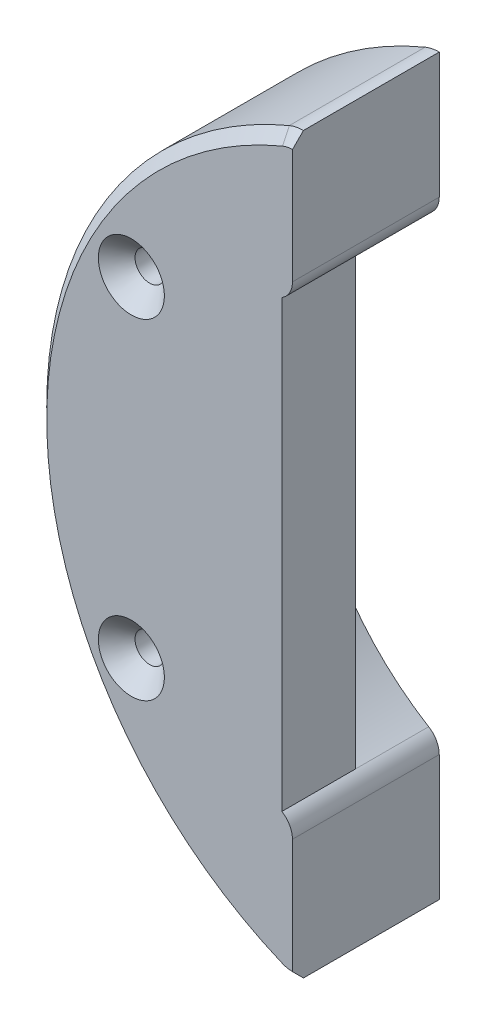
ISO-10303-21;
HEADER;
FILE_DESCRIPTION(('STEP AP214'),'2;1');
FILE_NAME('part.step','',(''),(''),'','','');
FILE_SCHEMA(('AUTOMOTIVE_DESIGN { 1 0 10303 214 1 1 1 1 }'));
ENDSEC;
DATA;
#1=APPLICATION_CONTEXT('core data for automotive mechanical design processes');
#2=APPLICATION_PROTOCOL_DEFINITION('international standard','automotive_design',2000,#1);
#3=PRODUCT_CONTEXT('',#1,'mechanical');
#4=PRODUCT('Part','Part','',(#3));
#5=PRODUCT_RELATED_PRODUCT_CATEGORY('part','',(#4));
#6=PRODUCT_DEFINITION_FORMATION('','',#4);
#7=PRODUCT_DEFINITION_CONTEXT('part definition',#1,'design');
#8=PRODUCT_DEFINITION('design','',#6,#7);
#9=PRODUCT_DEFINITION_SHAPE('','',#8);
#10=(LENGTH_UNIT() NAMED_UNIT(*) SI_UNIT(.MILLI.,.METRE.));
#11=(NAMED_UNIT(*) PLANE_ANGLE_UNIT() SI_UNIT($,.RADIAN.));
#12=(NAMED_UNIT(*) SI_UNIT($,.STERADIAN.) SOLID_ANGLE_UNIT());
#13=UNCERTAINTY_MEASURE_WITH_UNIT(LENGTH_MEASURE(1.E-05),#10,'distance_accuracy_value','');
#14=(GEOMETRIC_REPRESENTATION_CONTEXT(3) GLOBAL_UNCERTAINTY_ASSIGNED_CONTEXT((#13)) GLOBAL_UNIT_ASSIGNED_CONTEXT((#10,
#11,#12)) REPRESENTATION_CONTEXT('',''));
#15=CARTESIAN_POINT('',(0.,0.,0.));
#16=DIRECTION('',(0.,0.,1.));
#17=DIRECTION('',(1.,0.,0.));
#18=AXIS2_PLACEMENT_3D('',#15,#16,#17);
#19=CARTESIAN_POINT('',(-60.0000000000072,8.99696983580611E-12,10.));
#20=DIRECTION('',(0.,0.,-1.));
#21=DIRECTION('',(-1.,0.,0.));
#22=AXIS2_PLACEMENT_3D('',#19,#20,#21);
#23=CYLINDRICAL_SURFACE('',#22,35.5);
#24=DIRECTION('',(0.,0.,-1.));
#25=VECTOR('',#24,1.);
#26=CARTESIAN_POINT('',(-78.4632238254018,30.3209393979462,10.));
#27=LINE('',#26,#25);
#28=CARTESIAN_POINT('',(-78.4632238254018,30.3209393979462,0.));
#29=VERTEX_POINT('',#28);
#30=CARTESIAN_POINT('',(-78.4632238254018,30.3209393979462,-10.));
#31=VERTEX_POINT('',#30);
#32=EDGE_CURVE('E59',#29,#31,#27,.T.);
#33=ORIENTED_EDGE('',*,*,#32,.F.);
#34=CARTESIAN_POINT('',(-60.0000000000072,8.99696983580611E-12,0.));
#35=DIRECTION('',(0.,0.,1.));
#36=DIRECTION('',(1.,0.,0.));
#37=AXIS2_PLACEMENT_3D('',#34,#35,#36);
#38=CIRCLE('',#37,35.5);
#39=CARTESIAN_POINT('',(-78.4632238254018,-30.3209393979282,0.));
#40=VERTEX_POINT('',#39);
#41=EDGE_CURVE('E64',#29,#40,#38,.T.);
#42=ORIENTED_EDGE('',*,*,#41,.T.);
#43=DIRECTION('',(0.,0.,-1.));
#44=VECTOR('',#43,1.);
#45=CARTESIAN_POINT('',(-78.4632238254018,-30.3209393979282,10.));
#46=LINE('',#45,#44);
#47=CARTESIAN_POINT('',(-78.4632238254018,-30.3209393979282,-10.));
#48=VERTEX_POINT('',#47);
#49=EDGE_CURVE('E138',#40,#48,#46,.T.);
#50=ORIENTED_EDGE('',*,*,#49,.T.);
#51=CARTESIAN_POINT('',(-60.0000000000072,8.99696983580611E-12,-10.));
#52=DIRECTION('',(0.,0.,1.));
#53=DIRECTION('',(1.,0.,0.));
#54=AXIS2_PLACEMENT_3D('',#51,#52,#53);
#55=CIRCLE('',#54,35.5);
#56=EDGE_CURVE('E169',#31,#48,#55,.T.);
#57=ORIENTED_EDGE('',*,*,#56,.F.);
#58=EDGE_LOOP('',(#33,#42,#50,#57));
#59=FACE_BOUND('',#58,.T.);
#60=ADVANCED_FACE('F41',(#59),#23,.F.);
#61=CARTESIAN_POINT('',(-80.0234962613507,32.8832723048141,10.));
#62=DIRECTION('',(0.,0.,-1.));
#63=DIRECTION('',(-1.,0.,0.));
#64=AXIS2_PLACEMENT_3D('',#61,#62,#63);
#65=CYLINDRICAL_SURFACE('',#64,3.);
#66=CARTESIAN_POINT('',(-80.0234962613507,32.8832723048141,-10.));
#67=DIRECTION('',(0.,0.,1.));
#68=DIRECTION('',(1.,0.,0.));
#69=AXIS2_PLACEMENT_3D('',#66,#67,#68);
#70=CIRCLE('',#69,3.);
#71=CARTESIAN_POINT('',(-77.0234962613507,32.8832723048141,-10.));
#72=VERTEX_POINT('',#71);
#73=EDGE_CURVE('E172',#31,#72,#70,.T.);
#74=ORIENTED_EDGE('',*,*,#73,.T.);
#75=DIRECTION('',(0.,0.,-1.));
#76=VECTOR('',#75,1.);
#77=CARTESIAN_POINT('',(-77.0234962613507,32.8832723048141,10.));
#78=LINE('',#77,#76);
#79=CARTESIAN_POINT('',(-77.0234962613507,32.8832723048141,10.));
#80=VERTEX_POINT('',#79);
#81=EDGE_CURVE('E201',#80,#72,#78,.T.);
#82=ORIENTED_EDGE('',*,*,#81,.F.);
#83=CARTESIAN_POINT('',(-80.0234962613507,32.8832723048141,10.));
#84=DIRECTION('',(0.,0.,1.));
#85=DIRECTION('',(1.,0.,0.));
#86=AXIS2_PLACEMENT_3D('',#83,#84,#85);
#87=CIRCLE('',#86,3.);
#88=CARTESIAN_POINT('',(-78.4632238254018,30.3209393979462,10.));
#89=VERTEX_POINT('',#88);
#90=EDGE_CURVE('E157',#89,#80,#87,.T.);
#91=ORIENTED_EDGE('',*,*,#90,.F.);
#92=EDGE_CURVE('E150',#89,#29,#27,.T.);
#93=ORIENTED_EDGE('',*,*,#92,.T.);
#94=ORIENTED_EDGE('',*,*,#32,.T.);
#95=EDGE_LOOP('',(#74,#82,#91,#93,#94));
#96=FACE_BOUND('',#95,.T.);
#97=ADVANCED_FACE('F266',(#96),#65,.T.);
#98=CARTESIAN_POINT('',(-77.0234962613506,-1.87345809847362E-13,10.));
#99=DIRECTION('',(-1.,0.,0.));
#100=DIRECTION('',(0.,-1.,0.));
#101=AXIS2_PLACEMENT_3D('',#98,#99,#100);
#102=PLANE('',#101);
#103=DIRECTION('',(0.,0.,-1.));
#104=VECTOR('',#103,1.);
#105=CARTESIAN_POINT('',(-77.0234962613507,50.0000000000089,10.));
#106=LINE('',#105,#104);
#107=CARTESIAN_POINT('',(-77.0234962613507,50.0000000000089,8.50000000000002));
#108=VERTEX_POINT('',#107);
#109=CARTESIAN_POINT('',(-77.0234962613507,50.0000000000089,-10.));
#110=VERTEX_POINT('',#109);
#111=EDGE_CURVE('E199',#108,#110,#106,.T.);
#112=ORIENTED_EDGE('',*,*,#111,.F.);
#113=DIRECTION('',(0.,0.707106781186549,-0.707106781186546));
#114=VECTOR('',#113,1.);
#115=CARTESIAN_POINT('',(-77.0234962613507,45.0000000000089,13.5));
#116=LINE('',#115,#114);
#117=CARTESIAN_POINT('',(-77.0234962613507,48.5000000000089,10.));
#118=VERTEX_POINT('',#117);
#119=EDGE_CURVE('E226',#108,#118,#116,.F.);
#120=ORIENTED_EDGE('',*,*,#119,.T.);
#121=DIRECTION('',(0.,1.,0.));
#122=VECTOR('',#121,1.);
#123=CARTESIAN_POINT('',(-77.0234962613506,-1.87345809847362E-13,10.));
#124=LINE('',#123,#122);
#125=EDGE_CURVE('E159',#80,#118,#124,.T.);
#126=ORIENTED_EDGE('',*,*,#125,.F.);
#127=ORIENTED_EDGE('',*,*,#81,.T.);
#128=DIRECTION('',(0.,1.,0.));
#129=VECTOR('',#128,1.);
#130=CARTESIAN_POINT('',(-77.0234962613506,-1.87345809847362E-13,-10.));
#131=LINE('',#130,#129);
#132=EDGE_CURVE('E175',#72,#110,#131,.T.);
#133=ORIENTED_EDGE('',*,*,#132,.T.);
#134=EDGE_LOOP('',(#112,#120,#126,#127,#133));
#135=FACE_BOUND('',#134,.T.);
#136=ADVANCED_FACE('F263',(#135),#102,.F.);
#137=CARTESIAN_POINT('',(-77.0234962613507,45.0000000000089,10.));
#138=DIRECTION('',(0.,0.,-1.));
#139=DIRECTION('',(-1.,0.,0.));
#140=AXIS2_PLACEMENT_3D('',#137,#138,#139);
#141=CYLINDRICAL_SURFACE('',#140,5.);
#142=DIRECTION('',(0.,0.,-1.));
#143=VECTOR('',#142,1.);
#144=CARTESIAN_POINT('',(-78.9499102326585,49.6139927623732,10.));
#145=LINE('',#144,#143);
#146=CARTESIAN_POINT('',(-78.9499102326585,49.6139927623732,8.50000000000002));
#147=VERTEX_POINT('',#146);
#148=CARTESIAN_POINT('',(-78.9499102326585,49.6139927623732,-10.));
#149=VERTEX_POINT('',#148);
#150=EDGE_CURVE('E197',#147,#149,#145,.T.);
#151=ORIENTED_EDGE('',*,*,#150,.F.);
#152=CARTESIAN_POINT('',(-77.0234962613507,45.0000000000089,8.50000000000002));
#153=DIRECTION('',(0.,0.,1.));
#154=DIRECTION('',(1.,0.,0.));
#155=AXIS2_PLACEMENT_3D('',#152,#153,#154);
#156=CIRCLE('',#155,5.);
#157=EDGE_CURVE('E224',#147,#108,#156,.F.);
#158=ORIENTED_EDGE('',*,*,#157,.T.);
#159=ORIENTED_EDGE('',*,*,#111,.T.);
#160=CARTESIAN_POINT('',(-77.0234962613507,45.0000000000089,-10.));
#161=DIRECTION('',(0.,0.,1.));
#162=DIRECTION('',(1.,0.,0.));
#163=AXIS2_PLACEMENT_3D('',#160,#161,#162);
#164=CIRCLE('',#163,5.);
#165=EDGE_CURVE('E178',#110,#149,#164,.T.);
#166=ORIENTED_EDGE('',*,*,#165,.T.);
#167=EDGE_LOOP('',(#151,#158,#159,#166));
#168=FACE_BOUND('',#167,.T.);
#169=ADVANCED_FACE('F255',(#168),#141,.T.);
#170=CARTESIAN_POINT('',(-58.235294117654,9.00494956379561E-12,10.));
#171=DIRECTION('',(0.,0.,-1.));
#172=DIRECTION('',(-1.,0.,0.));
#173=AXIS2_PLACEMENT_3D('',#170,#171,#172);
#174=CYLINDRICAL_SURFACE('',#173,53.764705882353);
#175=DIRECTION('',(0.,0.,-1.));
#176=VECTOR('',#175,1.);
#177=CARTESIAN_POINT('',(-78.9499102326578,-49.6139927623554,10.));
#178=LINE('',#177,#176);
#179=CARTESIAN_POINT('',(-78.9499102326578,-49.6139927623554,8.50000000000002));
#180=VERTEX_POINT('',#179);
#181=CARTESIAN_POINT('',(-78.9499102326578,-49.6139927623554,-10.));
#182=VERTEX_POINT('',#181);
#183=EDGE_CURVE('E195',#180,#182,#178,.T.);
#184=ORIENTED_EDGE('',*,*,#183,.F.);
#185=CARTESIAN_POINT('',(-58.235294117654,9.00494956379561E-12,8.50000000000002));
#186=DIRECTION('',(0.,0.,1.));
#187=DIRECTION('',(1.,0.,0.));
#188=AXIS2_PLACEMENT_3D('',#185,#186,#187);
#189=CIRCLE('',#188,53.764705882353);
#190=EDGE_CURVE('E11',#180,#147,#189,.F.);
#191=ORIENTED_EDGE('',*,*,#190,.T.);
#192=ORIENTED_EDGE('',*,*,#150,.T.);
#193=CARTESIAN_POINT('',(-58.235294117654,9.00494956379561E-12,-10.));
#194=DIRECTION('',(0.,0.,1.));
#195=DIRECTION('',(1.,0.,0.));
#196=AXIS2_PLACEMENT_3D('',#193,#194,#195);
#197=CIRCLE('',#196,53.764705882353);
#198=EDGE_CURVE('E181',#149,#182,#197,.T.);
#199=ORIENTED_EDGE('',*,*,#198,.T.);
#200=EDGE_LOOP('',(#184,#191,#192,#199));
#201=FACE_BOUND('',#200,.T.);
#202=ADVANCED_FACE('F251',(#201),#174,.T.);
#203=CARTESIAN_POINT('',(-77.0234962613503,-44.9999999999928,10.));
#204=DIRECTION('',(0.,0.,-1.));
#205=DIRECTION('',(-1.,0.,0.));
#206=AXIS2_PLACEMENT_3D('',#203,#204,#205);
#207=CYLINDRICAL_SURFACE('',#206,4.99999999999834);
#208=DIRECTION('',(0.,0.,-1.));
#209=VECTOR('',#208,1.);
#210=CARTESIAN_POINT('',(-77.02349626135,-49.9999999999911,10.));
#211=LINE('',#210,#209);
#212=CARTESIAN_POINT('',(-77.02349626135,-49.9999999999911,8.50000000000002));
#213=VERTEX_POINT('',#212);
#214=CARTESIAN_POINT('',(-77.02349626135,-49.9999999999911,-10.));
#215=VERTEX_POINT('',#214);
#216=EDGE_CURVE('E193',#213,#215,#211,.T.);
#217=ORIENTED_EDGE('',*,*,#216,.F.);
#218=CARTESIAN_POINT('',(-77.0234962613503,-44.9999999999928,8.50000000000002));
#219=DIRECTION('',(0.,0.,1.));
#220=DIRECTION('',(1.,0.,0.));
#221=AXIS2_PLACEMENT_3D('',#218,#219,#220);
#222=CIRCLE('',#221,4.99999999999834);
#223=EDGE_CURVE('E228',#213,#180,#222,.F.);
#224=ORIENTED_EDGE('',*,*,#223,.T.);
#225=ORIENTED_EDGE('',*,*,#183,.T.);
#226=CARTESIAN_POINT('',(-77.0234962613503,-44.9999999999928,-10.));
#227=DIRECTION('',(0.,0.,1.));
#228=DIRECTION('',(1.,0.,0.));
#229=AXIS2_PLACEMENT_3D('',#226,#227,#228);
#230=CIRCLE('',#229,4.99999999999834);
#231=EDGE_CURVE('E184',#215,#182,#230,.F.);
#232=ORIENTED_EDGE('',*,*,#231,.F.);
#233=EDGE_LOOP('',(#217,#224,#225,#232));
#234=FACE_BOUND('',#233,.T.);
#235=ADVANCED_FACE('F240',(#234),#207,.T.);
#236=CARTESIAN_POINT('',(-77.023496261352,-3.05998156084026E-12,10.));
#237=DIRECTION('',(1.,0.,0.));
#238=DIRECTION('',(0.,1.,0.));
#239=AXIS2_PLACEMENT_3D('',#236,#237,#238);
#240=PLANE('',#239);
#241=DIRECTION('',(0.,-1.,0.));
#242=VECTOR('',#241,1.);
#243=CARTESIAN_POINT('',(-77.023496261352,-3.05998156084026E-12,10.));
#244=LINE('',#243,#242);
#245=CARTESIAN_POINT('',(-77.0234962613507,-32.8832723047961,10.));
#246=VERTEX_POINT('',#245);
#247=CARTESIAN_POINT('',(-77.02349626135,-48.4999999999912,10.));
#248=VERTEX_POINT('',#247);
#249=EDGE_CURVE('E136',#246,#248,#244,.T.);
#250=ORIENTED_EDGE('',*,*,#249,.T.);
#251=DIRECTION('',(0.,-0.70710678118655,-0.707106781186545));
#252=VECTOR('',#251,1.);
#253=CARTESIAN_POINT('',(-77.0234962613502,-44.9999999999928,13.4999999999983));
#254=LINE('',#253,#252);
#255=EDGE_CURVE('E51',#248,#213,#254,.T.);
#256=ORIENTED_EDGE('',*,*,#255,.T.);
#257=ORIENTED_EDGE('',*,*,#216,.T.);
#258=DIRECTION('',(0.,-1.,0.));
#259=VECTOR('',#258,1.);
#260=CARTESIAN_POINT('',(-77.023496261352,-3.05998156084026E-12,-10.));
#261=LINE('',#260,#259);
#262=CARTESIAN_POINT('',(-77.0234962613507,-32.8832723047961,-10.));
#263=VERTEX_POINT('',#262);
#264=EDGE_CURVE('E187',#263,#215,#261,.T.);
#265=ORIENTED_EDGE('',*,*,#264,.F.);
#266=DIRECTION('',(0.,0.,-1.));
#267=VECTOR('',#266,1.);
#268=CARTESIAN_POINT('',(-77.0234962613507,-32.8832723047961,10.));
#269=LINE('',#268,#267);
#270=EDGE_CURVE('E147',#246,#263,#269,.T.);
#271=ORIENTED_EDGE('',*,*,#270,.F.);
#272=EDGE_LOOP('',(#250,#256,#257,#265,#271));
#273=FACE_BOUND('',#272,.T.);
#274=ADVANCED_FACE('F233',(#273),#240,.T.);
#275=CARTESIAN_POINT('',(-98.9711431703068,22.5000000000092,10.));
#276=DIRECTION('',(0.,0.,-1.));
#277=DIRECTION('',(-1.,0.,0.));
#278=AXIS2_PLACEMENT_3D('',#275,#276,#277);
#279=CYLINDRICAL_SURFACE('',#278,2.0000000000054);
#280=CARTESIAN_POINT('',(-98.9711431703068,22.5000000000092,7.49999999999999));
#281=DIRECTION('',(0.,0.,1.));
#282=DIRECTION('',(1.,0.,0.));
#283=AXIS2_PLACEMENT_3D('',#280,#281,#282);
#284=CIRCLE('',#283,2.0000000000054);
#285=CARTESIAN_POINT('',(-96.9711431703014,22.5000000000092,7.49999999999999));
#286=VERTEX_POINT('',#285);
#287=EDGE_CURVE('E214',#286,#286,#284,.T.);
#288=ORIENTED_EDGE('',*,*,#287,.T.);
#289=EDGE_LOOP('',(#288));
#290=FACE_BOUND('',#289,.T.);
#291=CARTESIAN_POINT('',(-98.9711431703068,22.5000000000092,-10.));
#292=DIRECTION('',(0.,0.,1.));
#293=DIRECTION('',(1.,0.,0.));
#294=AXIS2_PLACEMENT_3D('',#291,#292,#293);
#295=CIRCLE('',#294,2.0000000000054);
#296=CARTESIAN_POINT('',(-96.9711431703014,22.5000000000092,-10.));
#297=VERTEX_POINT('',#296);
#298=EDGE_CURVE('E166',#297,#297,#295,.T.);
#299=ORIENTED_EDGE('',*,*,#298,.F.);
#300=EDGE_LOOP('',(#299));
#301=FACE_BOUND('',#300,.T.);
#302=ADVANCED_FACE('F278',(#290,#301),#279,.F.);
#303=CARTESIAN_POINT('',(-98.9711431703071,-22.4999999999908,10.));
#304=DIRECTION('',(0.,0.,-1.));
#305=DIRECTION('',(-1.,0.,0.));
#306=AXIS2_PLACEMENT_3D('',#303,#304,#305);
#307=CYLINDRICAL_SURFACE('',#306,2.00000000000591);
#308=CARTESIAN_POINT('',(-98.9711431703071,-22.4999999999908,7.50000000000001));
#309=DIRECTION('',(0.,0.,1.));
#310=DIRECTION('',(1.,0.,0.));
#311=AXIS2_PLACEMENT_3D('',#308,#309,#310);
#312=CIRCLE('',#311,2.00000000000591);
#313=CARTESIAN_POINT('',(-96.9711431703012,-22.4999999999908,7.50000000000001));
#314=VERTEX_POINT('',#313);
#315=EDGE_CURVE('E205',#314,#314,#312,.T.);
#316=ORIENTED_EDGE('',*,*,#315,.T.);
#317=EDGE_LOOP('',(#316));
#318=FACE_BOUND('',#317,.T.);
#319=CARTESIAN_POINT('',(-98.9711431703071,-22.4999999999908,-10.));
#320=DIRECTION('',(0.,0.,1.));
#321=DIRECTION('',(1.,0.,0.));
#322=AXIS2_PLACEMENT_3D('',#319,#320,#321);
#323=CIRCLE('',#322,2.00000000000591);
#324=CARTESIAN_POINT('',(-96.9711431703012,-22.4999999999908,-10.));
#325=VERTEX_POINT('',#324);
#326=EDGE_CURVE('E163',#325,#325,#323,.T.);
#327=ORIENTED_EDGE('',*,*,#326,.F.);
#328=EDGE_LOOP('',(#327));
#329=FACE_BOUND('',#328,.T.);
#330=ADVANCED_FACE('F281',(#318,#329),#307,.F.);
#331=CARTESIAN_POINT('',(-80.0234962613507,-32.8832723047961,10.));
#332=DIRECTION('',(0.,0.,-1.));
#333=DIRECTION('',(-1.,0.,0.));
#334=AXIS2_PLACEMENT_3D('',#331,#332,#333);
#335=CYLINDRICAL_SURFACE('',#334,2.99999999999999);
#336=CARTESIAN_POINT('',(-80.0234962613507,-32.8832723047961,-10.));
#337=DIRECTION('',(0.,0.,1.));
#338=DIRECTION('',(1.,0.,0.));
#339=AXIS2_PLACEMENT_3D('',#336,#337,#338);
#340=CIRCLE('',#339,2.99999999999999);
#341=EDGE_CURVE('E160',#48,#263,#340,.F.);
#342=ORIENTED_EDGE('',*,*,#341,.F.);
#343=ORIENTED_EDGE('',*,*,#49,.F.);
#344=CARTESIAN_POINT('',(-78.4632238254018,-30.3209393979282,10.));
#345=VERTEX_POINT('',#344);
#346=EDGE_CURVE('E141',#345,#40,#46,.T.);
#347=ORIENTED_EDGE('',*,*,#346,.F.);
#348=CARTESIAN_POINT('',(-80.0234962613507,-32.8832723047961,10.));
#349=DIRECTION('',(0.,0.,1.));
#350=DIRECTION('',(1.,0.,0.));
#351=AXIS2_PLACEMENT_3D('',#348,#349,#350);
#352=CIRCLE('',#351,2.99999999999999);
#353=EDGE_CURVE('E126',#345,#246,#352,.F.);
#354=ORIENTED_EDGE('',*,*,#353,.T.);
#355=ORIENTED_EDGE('',*,*,#270,.T.);
#356=EDGE_LOOP('',(#342,#343,#347,#354,#355));
#357=FACE_BOUND('',#356,.T.);
#358=ADVANCED_FACE('F143',(#357),#335,.T.);
#359=CARTESIAN_POINT('',(0.,0.,10.));
#360=DIRECTION('',(0.,0.,1.));
#361=DIRECTION('',(1.,0.,0.));
#362=AXIS2_PLACEMENT_3D('',#359,#360,#361);
#363=PLANE('',#362);
#364=ORIENTED_EDGE('',*,*,#125,.T.);
#365=CARTESIAN_POINT('',(-77.0234962613507,45.0000000000089,10.));
#366=DIRECTION('',(0.,0.,1.));
#367=DIRECTION('',(1.,0.,0.));
#368=AXIS2_PLACEMENT_3D('',#365,#366,#367);
#369=CIRCLE('',#368,3.50000000000001);
#370=CARTESIAN_POINT('',(-78.3719860412662,48.2297949336639,10.));
#371=VERTEX_POINT('',#370);
#372=EDGE_CURVE('E221',#118,#371,#369,.T.);
#373=ORIENTED_EDGE('',*,*,#372,.T.);
#374=CARTESIAN_POINT('',(-58.235294117654,9.00494956379561E-12,10.));
#375=DIRECTION('',(0.,0.,1.));
#376=DIRECTION('',(1.,0.,0.));
#377=AXIS2_PLACEMENT_3D('',#374,#375,#376);
#378=CIRCLE('',#377,52.264705882353);
#379=CARTESIAN_POINT('',(-78.3719860412654,-48.2297949336462,10.));
#380=VERTEX_POINT('',#379);
#381=EDGE_CURVE('E217',#371,#380,#378,.T.);
#382=ORIENTED_EDGE('',*,*,#381,.T.);
#383=CARTESIAN_POINT('',(-77.0234962613503,-44.9999999999928,10.));
#384=DIRECTION('',(0.,0.,1.));
#385=DIRECTION('',(1.,0.,0.));
#386=AXIS2_PLACEMENT_3D('',#383,#384,#385);
#387=CIRCLE('',#386,3.49999999999835);
#388=EDGE_CURVE('E219',#380,#248,#387,.T.);
#389=ORIENTED_EDGE('',*,*,#388,.T.);
#390=ORIENTED_EDGE('',*,*,#249,.F.);
#391=ORIENTED_EDGE('',*,*,#353,.F.);
#392=DIRECTION('',(0.,1.,0.));
#393=VECTOR('',#392,1.);
#394=CARTESIAN_POINT('',(-78.4632238254018,-30.3209393979282,10.));
#395=LINE('',#394,#393);
#396=EDGE_CURVE('E133',#345,#89,#395,.T.);
#397=ORIENTED_EDGE('',*,*,#396,.T.);
#398=ORIENTED_EDGE('',*,*,#90,.T.);
#399=EDGE_LOOP('',(#364,#373,#382,#389,#390,#391,#397,#398));
#400=FACE_BOUND('',#399,.T.);
#401=CARTESIAN_POINT('',(-98.9711431703071,-22.4999999999908,10.));
#402=DIRECTION('',(0.,0.,1.));
#403=DIRECTION('',(1.,0.,0.));
#404=AXIS2_PLACEMENT_3D('',#401,#402,#403);
#405=CIRCLE('',#404,4.5000000000059);
#406=CARTESIAN_POINT('',(-94.4711431703012,-22.4999999999908,10.));
#407=VERTEX_POINT('',#406);
#408=EDGE_CURVE('E211',#407,#407,#405,.F.);
#409=ORIENTED_EDGE('',*,*,#408,.T.);
#410=EDGE_LOOP('',(#409));
#411=FACE_BOUND('',#410,.T.);
#412=CARTESIAN_POINT('',(-98.9711431703068,22.5000000000092,10.));
#413=DIRECTION('',(0.,0.,1.));
#414=DIRECTION('',(1.,0.,0.));
#415=AXIS2_PLACEMENT_3D('',#412,#413,#414);
#416=CIRCLE('',#415,4.50000000000542);
#417=CARTESIAN_POINT('',(-94.4711431703014,22.5000000000092,10.));
#418=VERTEX_POINT('',#417);
#419=EDGE_CURVE('E208',#418,#418,#416,.F.);
#420=ORIENTED_EDGE('',*,*,#419,.T.);
#421=EDGE_LOOP('',(#420));
#422=FACE_BOUND('',#421,.T.);
#423=ADVANCED_FACE('F129',(#400,#411,#422),#363,.T.);
#424=CARTESIAN_POINT('',(0.,0.,-10.));
#425=DIRECTION('',(0.,0.,1.));
#426=DIRECTION('',(1.,0.,0.));
#427=AXIS2_PLACEMENT_3D('',#424,#425,#426);
#428=PLANE('',#427);
#429=ORIENTED_EDGE('',*,*,#326,.T.);
#430=EDGE_LOOP('',(#429));
#431=FACE_BOUND('',#430,.T.);
#432=ORIENTED_EDGE('',*,*,#298,.T.);
#433=EDGE_LOOP('',(#432));
#434=FACE_BOUND('',#433,.T.);
#435=ORIENTED_EDGE('',*,*,#56,.T.);
#436=ORIENTED_EDGE('',*,*,#341,.T.);
#437=ORIENTED_EDGE('',*,*,#264,.T.);
#438=ORIENTED_EDGE('',*,*,#231,.T.);
#439=ORIENTED_EDGE('',*,*,#198,.F.);
#440=ORIENTED_EDGE('',*,*,#165,.F.);
#441=ORIENTED_EDGE('',*,*,#132,.F.);
#442=ORIENTED_EDGE('',*,*,#73,.F.);
#443=EDGE_LOOP('',(#435,#436,#437,#438,#439,#440,#441,#442));
#444=FACE_BOUND('',#443,.T.);
#445=ADVANCED_FACE('F269',(#431,#434,#444),#428,.F.);
#446=CARTESIAN_POINT('',(-98.9711431703071,-22.4999999999908,7.50000000000001));
#447=DIRECTION('',(0.,0.,1.));
#448=DIRECTION('',(1.,0.,0.));
#449=AXIS2_PLACEMENT_3D('',#446,#447,#448);
#450=CONICAL_SURFACE('',#449,2.00000000000591,0.78539816339745);
#451=ORIENTED_EDGE('',*,*,#408,.F.);
#452=EDGE_LOOP('',(#451));
#453=FACE_BOUND('',#452,.T.);
#454=ORIENTED_EDGE('',*,*,#315,.F.);
#455=EDGE_LOOP('',(#454));
#456=FACE_BOUND('',#455,.T.);
#457=ADVANCED_FACE('F287',(#453,#456),#450,.F.);
#458=CARTESIAN_POINT('',(-98.9711431703068,22.5000000000092,7.49999999999999));
#459=DIRECTION('',(0.,0.,1.));
#460=DIRECTION('',(1.,0.,0.));
#461=AXIS2_PLACEMENT_3D('',#458,#459,#460);
#462=CONICAL_SURFACE('',#461,2.0000000000054,0.78539816339745);
#463=ORIENTED_EDGE('',*,*,#419,.F.);
#464=EDGE_LOOP('',(#463));
#465=FACE_BOUND('',#464,.T.);
#466=ORIENTED_EDGE('',*,*,#287,.F.);
#467=EDGE_LOOP('',(#466));
#468=FACE_BOUND('',#467,.T.);
#469=ADVANCED_FACE('F293',(#465,#468),#462,.F.);
#470=CARTESIAN_POINT('',(-77.0234962613503,-44.9999999999928,8.50000000000002));
#471=DIRECTION('',(0.,0.,-1.));
#472=DIRECTION('',(-1.,0.,0.));
#473=AXIS2_PLACEMENT_3D('',#470,#471,#472);
#474=CONICAL_SURFACE('',#473,4.99999999999834,0.785398163397451);
#475=ORIENTED_EDGE('',*,*,#255,.F.);
#476=ORIENTED_EDGE('',*,*,#388,.F.);
#477=DIRECTION('',(0.272436076496906,0.652517114122668,0.707106781186546));
#478=VECTOR('',#477,1.);
#479=CARTESIAN_POINT('',(-78.9499102326578,-49.6139927623554,8.50000000000002));
#480=LINE('',#479,#478);
#481=EDGE_CURVE('E46',#180,#380,#480,.T.);
#482=ORIENTED_EDGE('',*,*,#481,.F.);
#483=ORIENTED_EDGE('',*,*,#223,.F.);
#484=EDGE_LOOP('',(#475,#476,#482,#483));
#485=FACE_BOUND('',#484,.T.);
#486=ADVANCED_FACE('F44',(#485),#474,.T.);
#487=CARTESIAN_POINT('',(-58.235294117654,9.00494956379561E-12,10.));
#488=DIRECTION('',(0.,0.,-1.));
#489=DIRECTION('',(-1.,0.,0.));
#490=AXIS2_PLACEMENT_3D('',#487,#488,#489);
#491=CONICAL_SURFACE('',#490,52.264705882353,0.785398163397451);
#492=ORIENTED_EDGE('',*,*,#481,.T.);
#493=ORIENTED_EDGE('',*,*,#381,.F.);
#494=DIRECTION('',(0.27243607649686,-0.652517114122685,0.707106781186547));
#495=VECTOR('',#494,1.);
#496=CARTESIAN_POINT('',(-78.9499102326585,49.6139927623732,8.50000000000002));
#497=LINE('',#496,#495);
#498=EDGE_CURVE('E151',#147,#371,#497,.T.);
#499=ORIENTED_EDGE('',*,*,#498,.F.);
#500=ORIENTED_EDGE('',*,*,#190,.F.);
#501=EDGE_LOOP('',(#492,#493,#499,#500));
#502=FACE_BOUND('',#501,.T.);
#503=ADVANCED_FACE('F248',(#502),#491,.T.);
#504=CARTESIAN_POINT('',(-77.0234962613507,45.0000000000089,10.));
#505=DIRECTION('',(0.,0.,-1.));
#506=DIRECTION('',(-1.,0.,0.));
#507=AXIS2_PLACEMENT_3D('',#504,#505,#506);
#508=CONICAL_SURFACE('',#507,3.50000000000001,0.78539816339745);
#509=ORIENTED_EDGE('',*,*,#119,.F.);
#510=ORIENTED_EDGE('',*,*,#157,.F.);
#511=ORIENTED_EDGE('',*,*,#498,.T.);
#512=ORIENTED_EDGE('',*,*,#372,.F.);
#513=EDGE_LOOP('',(#509,#510,#511,#512));
#514=FACE_BOUND('',#513,.T.);
#515=ADVANCED_FACE('F260',(#514),#508,.T.);
#516=CARTESIAN_POINT('',(-78.4632238254018,-30.3209393979282,10.));
#517=DIRECTION('',(-1.,0.,0.));
#518=DIRECTION('',(0.,0.,1.));
#519=AXIS2_PLACEMENT_3D('',#516,#517,#518);
#520=PLANE('',#519);
#521=DIRECTION('',(0.,1.,0.));
#522=VECTOR('',#521,1.);
#523=CARTESIAN_POINT('',(-78.4632238254018,-30.3209393979282,0.));
#524=LINE('',#523,#522);
#525=EDGE_CURVE('E152',#40,#29,#524,.T.);
#526=ORIENTED_EDGE('',*,*,#525,.T.);
#527=ORIENTED_EDGE('',*,*,#92,.F.);
#528=ORIENTED_EDGE('',*,*,#396,.F.);
#529=ORIENTED_EDGE('',*,*,#346,.T.);
#530=EDGE_LOOP('',(#526,#527,#528,#529));
#531=FACE_BOUND('',#530,.T.);
#532=ADVANCED_FACE('F149',(#531),#520,.F.);
#533=CARTESIAN_POINT('',(-60.0000000000072,8.99696983580611E-12,0.));
#534=DIRECTION('',(0.,0.,1.));
#535=DIRECTION('',(1.,0.,0.));
#536=AXIS2_PLACEMENT_3D('',#533,#534,#535);
#537=PLANE('',#536);
#538=ORIENTED_EDGE('',*,*,#41,.F.);
#539=ORIENTED_EDGE('',*,*,#525,.F.);
#540=EDGE_LOOP('',(#538,#539));
#541=FACE_BOUND('',#540,.T.);
#542=ADVANCED_FACE('F461',(#541),#537,.F.);
#543=CLOSED_SHELL('',(#60,#97,#136,#169,#202,#235,#274,#302,#330,#358,#423,#445,#457,#469,#486,
#503,#515,#532,#542));
#544=MANIFOLD_SOLID_BREP('B2',#543);
#545=ADVANCED_BREP_SHAPE_REPRESENTATION('',(#18,#544),#14);
#546=SHAPE_DEFINITION_REPRESENTATION(#9,#545);
ENDSEC;
END-ISO-10303-21;
